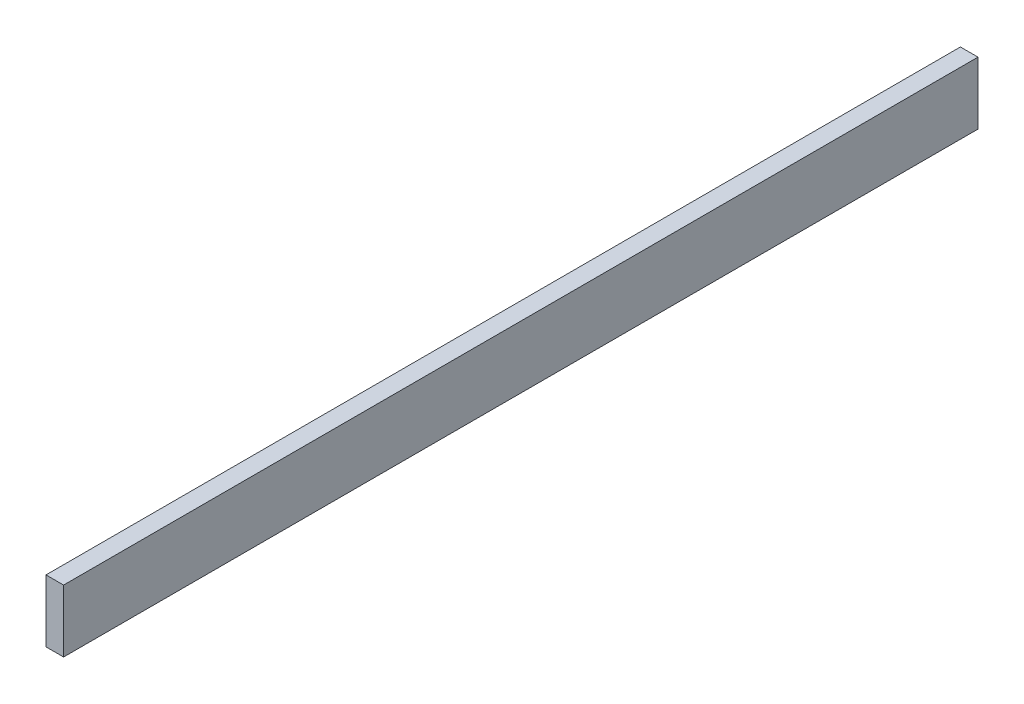
ISO-10303-21;
HEADER;
FILE_DESCRIPTION(('STEP AP214'),'2;1');
FILE_NAME('part.step','',(''),(''),'','','');
FILE_SCHEMA(('AUTOMOTIVE_DESIGN { 1 0 10303 214 1 1 1 1 }'));
ENDSEC;
DATA;
#1=APPLICATION_CONTEXT('core data for automotive mechanical design processes');
#2=APPLICATION_PROTOCOL_DEFINITION('international standard','automotive_design',2000,#1);
#3=PRODUCT_CONTEXT('',#1,'mechanical');
#4=PRODUCT('Part','Part','',(#3));
#5=PRODUCT_RELATED_PRODUCT_CATEGORY('part','',(#4));
#6=PRODUCT_DEFINITION_FORMATION('','',#4);
#7=PRODUCT_DEFINITION_CONTEXT('part definition',#1,'design');
#8=PRODUCT_DEFINITION('design','',#6,#7);
#9=PRODUCT_DEFINITION_SHAPE('','',#8);
#10=(LENGTH_UNIT() NAMED_UNIT(*) SI_UNIT(.MILLI.,.METRE.));
#11=(NAMED_UNIT(*) PLANE_ANGLE_UNIT() SI_UNIT($,.RADIAN.));
#12=(NAMED_UNIT(*) SI_UNIT($,.STERADIAN.) SOLID_ANGLE_UNIT());
#13=UNCERTAINTY_MEASURE_WITH_UNIT(LENGTH_MEASURE(1.E-05),#10,'distance_accuracy_value','');
#14=(GEOMETRIC_REPRESENTATION_CONTEXT(3) GLOBAL_UNCERTAINTY_ASSIGNED_CONTEXT((#13)) GLOBAL_UNIT_ASSIGNED_CONTEXT((#10,
#11,#12)) REPRESENTATION_CONTEXT('',''));
#15=CARTESIAN_POINT('',(0.,0.,0.));
#16=DIRECTION('',(0.,0.,1.));
#17=DIRECTION('',(1.,0.,0.));
#18=AXIS2_PLACEMENT_3D('',#15,#16,#17);
#19=CARTESIAN_POINT('',(605.3,18.,-660.));
#20=DIRECTION('',(-1.,0.,0.));
#21=DIRECTION('',(0.,0.,1.));
#22=AXIS2_PLACEMENT_3D('',#19,#20,#21);
#23=PLANE('',#22);
#24=DIRECTION('',(0.,-1.,0.));
#25=VECTOR('',#24,1.);
#26=CARTESIAN_POINT('',(605.3,18.,0.));
#27=LINE('',#26,#25);
#28=CARTESIAN_POINT('',(605.3,63.,0.));
#29=VERTEX_POINT('',#28);
#30=CARTESIAN_POINT('',(605.3,18.,0.));
#31=VERTEX_POINT('',#30);
#32=EDGE_CURVE('E103',#29,#31,#27,.T.);
#33=ORIENTED_EDGE('',*,*,#32,.F.);
#34=DIRECTION('',(0.,0.,1.));
#35=VECTOR('',#34,1.);
#36=CARTESIAN_POINT('',(605.3,63.,-660.));
#37=LINE('',#36,#35);
#38=CARTESIAN_POINT('',(605.3,63.,-660.));
#39=VERTEX_POINT('',#38);
#40=EDGE_CURVE('E11',#39,#29,#37,.T.);
#41=ORIENTED_EDGE('',*,*,#40,.F.);
#42=DIRECTION('',(0.,-1.,0.));
#43=VECTOR('',#42,1.);
#44=CARTESIAN_POINT('',(605.3,18.,-660.));
#45=LINE('',#44,#43);
#46=CARTESIAN_POINT('',(605.3,18.,-660.));
#47=VERTEX_POINT('',#46);
#48=EDGE_CURVE('E97',#39,#47,#45,.T.);
#49=ORIENTED_EDGE('',*,*,#48,.T.);
#50=DIRECTION('',(0.,0.,1.));
#51=VECTOR('',#50,1.);
#52=CARTESIAN_POINT('',(605.3,18.,-660.));
#53=LINE('',#52,#51);
#54=EDGE_CURVE('E42',#47,#31,#53,.T.);
#55=ORIENTED_EDGE('',*,*,#54,.T.);
#56=EDGE_LOOP('',(#33,#41,#49,#55));
#57=FACE_BOUND('',#56,.T.);
#58=ADVANCED_FACE('F39',(#57),#23,.T.);
#59=CARTESIAN_POINT('',(605.3,63.,-660.));
#60=DIRECTION('',(0.,1.,0.));
#61=DIRECTION('',(0.,0.,1.));
#62=AXIS2_PLACEMENT_3D('',#59,#60,#61);
#63=PLANE('',#62);
#64=DIRECTION('',(-1.,0.,0.));
#65=VECTOR('',#64,1.);
#66=CARTESIAN_POINT('',(605.3,63.,0.));
#67=LINE('',#66,#65);
#68=CARTESIAN_POINT('',(618.,63.,0.));
#69=VERTEX_POINT('',#68);
#70=EDGE_CURVE('E99',#69,#29,#67,.T.);
#71=ORIENTED_EDGE('',*,*,#70,.F.);
#72=DIRECTION('',(0.,0.,1.));
#73=VECTOR('',#72,1.);
#74=CARTESIAN_POINT('',(618.,63.,-660.));
#75=LINE('',#74,#73);
#76=CARTESIAN_POINT('',(618.,63.,-660.));
#77=VERTEX_POINT('',#76);
#78=EDGE_CURVE('E48',#77,#69,#75,.T.);
#79=ORIENTED_EDGE('',*,*,#78,.F.);
#80=DIRECTION('',(-1.,0.,0.));
#81=VECTOR('',#80,1.);
#82=CARTESIAN_POINT('',(605.3,63.,-660.));
#83=LINE('',#82,#81);
#84=EDGE_CURVE('E94',#77,#39,#83,.T.);
#85=ORIENTED_EDGE('',*,*,#84,.T.);
#86=ORIENTED_EDGE('',*,*,#40,.T.);
#87=EDGE_LOOP('',(#71,#79,#85,#86));
#88=FACE_BOUND('',#87,.T.);
#89=ADVANCED_FACE('F113',(#88),#63,.T.);
#90=CARTESIAN_POINT('',(618.,18.,-660.));
#91=DIRECTION('',(1.,0.,0.));
#92=DIRECTION('',(0.,0.,-1.));
#93=AXIS2_PLACEMENT_3D('',#90,#91,#92);
#94=PLANE('',#93);
#95=DIRECTION('',(0.,1.,0.));
#96=VECTOR('',#95,1.);
#97=CARTESIAN_POINT('',(618.,18.,0.));
#98=LINE('',#97,#96);
#99=CARTESIAN_POINT('',(618.,18.,0.));
#100=VERTEX_POINT('',#99);
#101=EDGE_CURVE('E89',#100,#69,#98,.T.);
#102=ORIENTED_EDGE('',*,*,#101,.F.);
#103=DIRECTION('',(0.,0.,1.));
#104=VECTOR('',#103,1.);
#105=CARTESIAN_POINT('',(618.,18.,-660.));
#106=LINE('',#105,#104);
#107=CARTESIAN_POINT('',(618.,18.,-660.));
#108=VERTEX_POINT('',#107);
#109=EDGE_CURVE('E84',#108,#100,#106,.T.);
#110=ORIENTED_EDGE('',*,*,#109,.F.);
#111=DIRECTION('',(0.,1.,0.));
#112=VECTOR('',#111,1.);
#113=CARTESIAN_POINT('',(618.,18.,-660.));
#114=LINE('',#113,#112);
#115=EDGE_CURVE('E87',#108,#77,#114,.T.);
#116=ORIENTED_EDGE('',*,*,#115,.T.);
#117=ORIENTED_EDGE('',*,*,#78,.T.);
#118=EDGE_LOOP('',(#102,#110,#116,#117));
#119=FACE_BOUND('',#118,.T.);
#120=ADVANCED_FACE('F86',(#119),#94,.T.);
#121=CARTESIAN_POINT('',(605.3,18.,-660.));
#122=DIRECTION('',(0.,-1.,0.));
#123=DIRECTION('',(0.,0.,-1.));
#124=AXIS2_PLACEMENT_3D('',#121,#122,#123);
#125=PLANE('',#124);
#126=DIRECTION('',(1.,0.,0.));
#127=VECTOR('',#126,1.);
#128=CARTESIAN_POINT('',(605.3,18.,0.));
#129=LINE('',#128,#127);
#130=EDGE_CURVE('E106',#31,#100,#129,.T.);
#131=ORIENTED_EDGE('',*,*,#130,.F.);
#132=ORIENTED_EDGE('',*,*,#54,.F.);
#133=DIRECTION('',(1.,0.,0.));
#134=VECTOR('',#133,1.);
#135=CARTESIAN_POINT('',(605.3,18.,-660.));
#136=LINE('',#135,#134);
#137=EDGE_CURVE('E93',#47,#108,#136,.T.);
#138=ORIENTED_EDGE('',*,*,#137,.T.);
#139=ORIENTED_EDGE('',*,*,#109,.T.);
#140=EDGE_LOOP('',(#131,#132,#138,#139));
#141=FACE_BOUND('',#140,.T.);
#142=ADVANCED_FACE('F96',(#141),#125,.T.);
#143=CARTESIAN_POINT('',(0.,0.,-660.));
#144=DIRECTION('',(0.,0.,-1.));
#145=DIRECTION('',(-1.,0.,0.));
#146=AXIS2_PLACEMENT_3D('',#143,#144,#145);
#147=PLANE('',#146);
#148=ORIENTED_EDGE('',*,*,#48,.F.);
#149=ORIENTED_EDGE('',*,*,#84,.F.);
#150=ORIENTED_EDGE('',*,*,#115,.F.);
#151=ORIENTED_EDGE('',*,*,#137,.F.);
#152=EDGE_LOOP('',(#148,#149,#150,#151));
#153=FACE_BOUND('',#152,.T.);
#154=ADVANCED_FACE('F92',(#153),#147,.T.);
#155=CARTESIAN_POINT('',(0.,0.,0.));
#156=DIRECTION('',(0.,0.,-1.));
#157=DIRECTION('',(-1.,0.,0.));
#158=AXIS2_PLACEMENT_3D('',#155,#156,#157);
#159=PLANE('',#158);
#160=ORIENTED_EDGE('',*,*,#32,.T.);
#161=ORIENTED_EDGE('',*,*,#130,.T.);
#162=ORIENTED_EDGE('',*,*,#101,.T.);
#163=ORIENTED_EDGE('',*,*,#70,.T.);
#164=EDGE_LOOP('',(#160,#161,#162,#163));
#165=FACE_BOUND('',#164,.T.);
#166=ADVANCED_FACE('F112',(#165),#159,.F.);
#167=CLOSED_SHELL('',(#58,#89,#120,#142,#154,#166));
#168=MANIFOLD_SOLID_BREP('B2',#167);
#169=ADVANCED_BREP_SHAPE_REPRESENTATION('',(#18,#168),#14);
#170=SHAPE_DEFINITION_REPRESENTATION(#9,#169);
ENDSEC;
END-ISO-10303-21;
